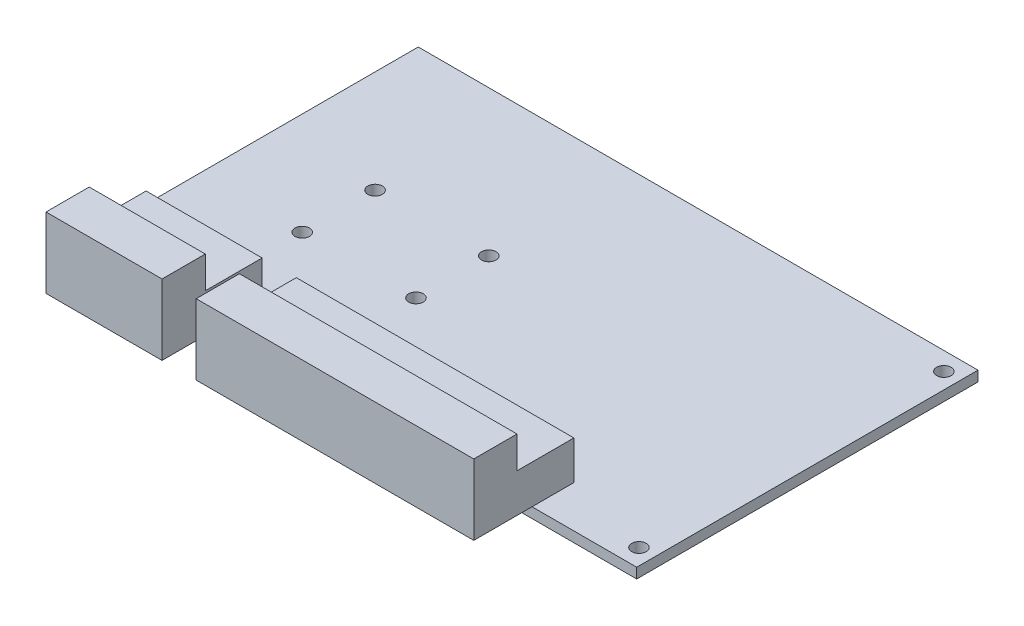
ISO-10303-21;
HEADER;
FILE_DESCRIPTION(('STEP AP214'),'2;1');
FILE_NAME('part.step','',(''),(''),'','','');
FILE_SCHEMA(('AUTOMOTIVE_DESIGN { 1 0 10303 214 1 1 1 1 }'));
ENDSEC;
DATA;
#1=APPLICATION_CONTEXT('core data for automotive mechanical design processes');
#2=APPLICATION_PROTOCOL_DEFINITION('international standard','automotive_design',2000,#1);
#3=PRODUCT_CONTEXT('',#1,'mechanical');
#4=PRODUCT('Part','Part','',(#3));
#5=PRODUCT_RELATED_PRODUCT_CATEGORY('part','',(#4));
#6=PRODUCT_DEFINITION_FORMATION('','',#4);
#7=PRODUCT_DEFINITION_CONTEXT('part definition',#1,'design');
#8=PRODUCT_DEFINITION('design','',#6,#7);
#9=PRODUCT_DEFINITION_SHAPE('','',#8);
#10=(LENGTH_UNIT() NAMED_UNIT(*) SI_UNIT(.MILLI.,.METRE.));
#11=(NAMED_UNIT(*) PLANE_ANGLE_UNIT() SI_UNIT($,.RADIAN.));
#12=(NAMED_UNIT(*) SI_UNIT($,.STERADIAN.) SOLID_ANGLE_UNIT());
#13=UNCERTAINTY_MEASURE_WITH_UNIT(LENGTH_MEASURE(1.E-05),#10,'distance_accuracy_value','');
#14=(GEOMETRIC_REPRESENTATION_CONTEXT(3) GLOBAL_UNCERTAINTY_ASSIGNED_CONTEXT((#13)) GLOBAL_UNIT_ASSIGNED_CONTEXT((#10,
#11,#12)) REPRESENTATION_CONTEXT('',''));
#15=CARTESIAN_POINT('',(0.,0.,0.));
#16=DIRECTION('',(0.,0.,1.));
#17=DIRECTION('',(1.,0.,0.));
#18=AXIS2_PLACEMENT_3D('',#15,#16,#17);
#19=CARTESIAN_POINT('',(0.,2.25,0.));
#20=DIRECTION('',(0.,-1.,0.));
#21=DIRECTION('',(0.,0.,-1.));
#22=AXIS2_PLACEMENT_3D('',#19,#20,#21);
#23=PLANE('',#22);
#24=CARTESIAN_POINT('',(119.5,2.25,-71.));
#25=DIRECTION('',(0.,1.,0.));
#26=DIRECTION('',(0.,0.,1.));
#27=AXIS2_PLACEMENT_3D('',#24,#25,#26);
#28=CIRCLE('',#27,1.60000000000001);
#29=CARTESIAN_POINT('',(119.5,2.25,-69.4));
#30=VERTEX_POINT('',#29);
#31=EDGE_CURVE('E302',#30,#30,#28,.T.);
#32=ORIENTED_EDGE('',*,*,#31,.F.);
#33=EDGE_LOOP('',(#32));
#34=FACE_BOUND('',#33,.T.);
#35=CARTESIAN_POINT('',(119.5,2.25,-4.));
#36=DIRECTION('',(0.,1.,0.));
#37=DIRECTION('',(0.,0.,1.));
#38=AXIS2_PLACEMENT_3D('',#35,#36,#37);
#39=CIRCLE('',#38,1.60000000000001);
#40=CARTESIAN_POINT('',(119.5,2.25,-2.4));
#41=VERTEX_POINT('',#40);
#42=EDGE_CURVE('E296',#41,#41,#39,.T.);
#43=ORIENTED_EDGE('',*,*,#42,.F.);
#44=EDGE_LOOP('',(#43));
#45=FACE_BOUND('',#44,.T.);
#46=CARTESIAN_POINT('',(3.5,2.25,-4.));
#47=DIRECTION('',(0.,1.,0.));
#48=DIRECTION('',(0.,0.,1.));
#49=AXIS2_PLACEMENT_3D('',#46,#47,#48);
#50=CIRCLE('',#49,1.6);
#51=CARTESIAN_POINT('',(3.5,2.25,-2.4));
#52=VERTEX_POINT('',#51);
#53=EDGE_CURVE('E290',#52,#52,#50,.T.);
#54=ORIENTED_EDGE('',*,*,#53,.F.);
#55=EDGE_LOOP('',(#54));
#56=FACE_BOUND('',#55,.T.);
#57=CARTESIAN_POINT('',(22.5,2.25,-43.));
#58=DIRECTION('',(0.,1.,0.));
#59=DIRECTION('',(0.,0.,1.));
#60=AXIS2_PLACEMENT_3D('',#57,#58,#59);
#61=CIRCLE('',#60,1.6);
#62=CARTESIAN_POINT('',(22.5,2.25,-41.4));
#63=VERTEX_POINT('',#62);
#64=EDGE_CURVE('E284',#63,#63,#61,.T.);
#65=ORIENTED_EDGE('',*,*,#64,.F.);
#66=EDGE_LOOP('',(#65));
#67=FACE_BOUND('',#66,.T.);
#68=CARTESIAN_POINT('',(47.5,2.25,-43.));
#69=DIRECTION('',(0.,1.,0.));
#70=DIRECTION('',(0.,0.,1.));
#71=AXIS2_PLACEMENT_3D('',#68,#69,#70);
#72=CIRCLE('',#71,1.6);
#73=CARTESIAN_POINT('',(47.5,2.25,-41.4));
#74=VERTEX_POINT('',#73);
#75=EDGE_CURVE('E278',#74,#74,#72,.T.);
#76=ORIENTED_EDGE('',*,*,#75,.F.);
#77=EDGE_LOOP('',(#76));
#78=FACE_BOUND('',#77,.T.);
#79=CARTESIAN_POINT('',(22.5,2.25,-27.));
#80=DIRECTION('',(0.,1.,0.));
#81=DIRECTION('',(0.,0.,1.));
#82=AXIS2_PLACEMENT_3D('',#79,#80,#81);
#83=CIRCLE('',#82,1.6);
#84=CARTESIAN_POINT('',(22.5,2.25,-25.4));
#85=VERTEX_POINT('',#84);
#86=EDGE_CURVE('E272',#85,#85,#83,.T.);
#87=ORIENTED_EDGE('',*,*,#86,.F.);
#88=EDGE_LOOP('',(#87));
#89=FACE_BOUND('',#88,.T.);
#90=CARTESIAN_POINT('',(47.5,2.25,-27.));
#91=DIRECTION('',(0.,1.,0.));
#92=DIRECTION('',(0.,0.,1.));
#93=AXIS2_PLACEMENT_3D('',#90,#91,#92);
#94=CIRCLE('',#93,1.6);
#95=CARTESIAN_POINT('',(47.5,2.25,-25.4));
#96=VERTEX_POINT('',#95);
#97=EDGE_CURVE('E266',#96,#96,#94,.T.);
#98=ORIENTED_EDGE('',*,*,#97,.F.);
#99=EDGE_LOOP('',(#98));
#100=FACE_BOUND('',#99,.T.);
#101=DIRECTION('',(0.,0.,1.));
#102=VECTOR('',#101,1.);
#103=CARTESIAN_POINT('',(39.,2.25,-9.2));
#104=LINE('',#103,#102);
#105=CARTESIAN_POINT('',(39.,2.25,-9.2));
#106=VERTEX_POINT('',#105);
#107=CARTESIAN_POINT('',(39.,2.25,0.));
#108=VERTEX_POINT('',#107);
#109=EDGE_CURVE('E222',#106,#108,#104,.T.);
#110=ORIENTED_EDGE('',*,*,#109,.F.);
#111=DIRECTION('',(-1.,0.,0.));
#112=VECTOR('',#111,1.);
#113=CARTESIAN_POINT('',(39.,2.25,-9.2));
#114=LINE('',#113,#112);
#115=CARTESIAN_POINT('',(100.,2.25,-9.2));
#116=VERTEX_POINT('',#115);
#117=EDGE_CURVE('E217',#116,#106,#114,.T.);
#118=ORIENTED_EDGE('',*,*,#117,.F.);
#119=DIRECTION('',(0.,0.,-1.));
#120=VECTOR('',#119,1.);
#121=CARTESIAN_POINT('',(100.,2.25,-9.2));
#122=LINE('',#121,#120);
#123=CARTESIAN_POINT('',(100.,2.25,0.));
#124=VERTEX_POINT('',#123);
#125=EDGE_CURVE('E226',#124,#116,#122,.T.);
#126=ORIENTED_EDGE('',*,*,#125,.F.);
#127=DIRECTION('',(1.,0.,0.));
#128=VECTOR('',#127,1.);
#129=CARTESIAN_POINT('',(0.,2.25,0.));
#130=LINE('',#129,#128);
#131=CARTESIAN_POINT('',(123.,2.25,0.));
#132=VERTEX_POINT('',#131);
#133=EDGE_CURVE('E311',#124,#132,#130,.T.);
#134=ORIENTED_EDGE('',*,*,#133,.T.);
#135=DIRECTION('',(0.,0.,-1.));
#136=VECTOR('',#135,1.);
#137=CARTESIAN_POINT('',(123.,2.25,0.));
#138=LINE('',#137,#136);
#139=CARTESIAN_POINT('',(123.,2.25,-75.));
#140=VERTEX_POINT('',#139);
#141=EDGE_CURVE('E316',#132,#140,#138,.T.);
#142=ORIENTED_EDGE('',*,*,#141,.T.);
#143=DIRECTION('',(-1.,0.,0.));
#144=VECTOR('',#143,1.);
#145=CARTESIAN_POINT('',(0.,2.25,-75.));
#146=LINE('',#145,#144);
#147=CARTESIAN_POINT('',(0.,2.25,-75.));
#148=VERTEX_POINT('',#147);
#149=EDGE_CURVE('E319',#140,#148,#146,.T.);
#150=ORIENTED_EDGE('',*,*,#149,.T.);
#151=DIRECTION('',(0.,0.,1.));
#152=VECTOR('',#151,1.);
#153=CARTESIAN_POINT('',(0.,2.25,0.));
#154=LINE('',#153,#152);
#155=CARTESIAN_POINT('',(0.,2.25,0.));
#156=VERTEX_POINT('',#155);
#157=EDGE_CURVE('E308',#148,#156,#154,.T.);
#158=ORIENTED_EDGE('',*,*,#157,.T.);
#159=CARTESIAN_POINT('',(6.,2.25,0.));
#160=VERTEX_POINT('',#159);
#161=EDGE_CURVE('E313',#156,#160,#130,.T.);
#162=ORIENTED_EDGE('',*,*,#161,.T.);
#163=DIRECTION('',(0.,0.,1.));
#164=VECTOR('',#163,1.);
#165=CARTESIAN_POINT('',(6.,2.25,-9.2));
#166=LINE('',#165,#164);
#167=CARTESIAN_POINT('',(6.,2.25,-9.2));
#168=VERTEX_POINT('',#167);
#169=EDGE_CURVE('E246',#168,#160,#166,.T.);
#170=ORIENTED_EDGE('',*,*,#169,.F.);
#171=DIRECTION('',(-1.,0.,0.));
#172=VECTOR('',#171,1.);
#173=CARTESIAN_POINT('',(6.,2.25,-9.2));
#174=LINE('',#173,#172);
#175=CARTESIAN_POINT('',(31.5,2.25,-9.2));
#176=VERTEX_POINT('',#175);
#177=EDGE_CURVE('E241',#176,#168,#174,.T.);
#178=ORIENTED_EDGE('',*,*,#177,.F.);
#179=DIRECTION('',(0.,0.,-1.));
#180=VECTOR('',#179,1.);
#181=CARTESIAN_POINT('',(31.5,2.25,-9.2));
#182=LINE('',#181,#180);
#183=CARTESIAN_POINT('',(31.5,2.25,0.));
#184=VERTEX_POINT('',#183);
#185=EDGE_CURVE('E11',#184,#176,#182,.T.);
#186=ORIENTED_EDGE('',*,*,#185,.F.);
#187=EDGE_CURVE('E361',#184,#108,#130,.T.);
#188=ORIENTED_EDGE('',*,*,#187,.T.);
#189=EDGE_LOOP('',(#110,#118,#126,#134,#142,#150,#158,#162,#170,#178,#186,#188));
#190=FACE_BOUND('',#189,.T.);
#191=ADVANCED_FACE('F34',(#34,#45,#56,#67,#78,#89,#100,#190),#23,.F.);
#192=CARTESIAN_POINT('',(0.,0.,0.));
#193=DIRECTION('',(0.,-1.,0.));
#194=DIRECTION('',(0.,0.,-1.));
#195=AXIS2_PLACEMENT_3D('',#192,#193,#194);
#196=PLANE('',#195);
#197=CARTESIAN_POINT('',(22.5,0.,-27.));
#198=DIRECTION('',(0.,1.,0.));
#199=DIRECTION('',(0.,0.,1.));
#200=AXIS2_PLACEMENT_3D('',#197,#198,#199);
#201=CIRCLE('',#200,1.6);
#202=CARTESIAN_POINT('',(22.5,0.,-25.4));
#203=VERTEX_POINT('',#202);
#204=EDGE_CURVE('E269',#203,#203,#201,.T.);
#205=ORIENTED_EDGE('',*,*,#204,.T.);
#206=EDGE_LOOP('',(#205));
#207=FACE_BOUND('',#206,.T.);
#208=CARTESIAN_POINT('',(22.5,0.,-43.));
#209=DIRECTION('',(0.,1.,0.));
#210=DIRECTION('',(0.,0.,1.));
#211=AXIS2_PLACEMENT_3D('',#208,#209,#210);
#212=CIRCLE('',#211,1.6);
#213=CARTESIAN_POINT('',(22.5,0.,-41.4));
#214=VERTEX_POINT('',#213);
#215=EDGE_CURVE('E281',#214,#214,#212,.T.);
#216=ORIENTED_EDGE('',*,*,#215,.T.);
#217=EDGE_LOOP('',(#216));
#218=FACE_BOUND('',#217,.T.);
#219=CARTESIAN_POINT('',(119.5,0.,-4.));
#220=DIRECTION('',(0.,1.,0.));
#221=DIRECTION('',(0.,0.,1.));
#222=AXIS2_PLACEMENT_3D('',#219,#220,#221);
#223=CIRCLE('',#222,1.60000000000001);
#224=CARTESIAN_POINT('',(119.5,0.,-2.4));
#225=VERTEX_POINT('',#224);
#226=EDGE_CURVE('E293',#225,#225,#223,.T.);
#227=ORIENTED_EDGE('',*,*,#226,.T.);
#228=EDGE_LOOP('',(#227));
#229=FACE_BOUND('',#228,.T.);
#230=DIRECTION('',(0.,0.,1.));
#231=VECTOR('',#230,1.);
#232=CARTESIAN_POINT('',(0.,0.,0.));
#233=LINE('',#232,#231);
#234=CARTESIAN_POINT('',(0.,0.,-75.));
#235=VERTEX_POINT('',#234);
#236=CARTESIAN_POINT('',(0.,0.,0.));
#237=VERTEX_POINT('',#236);
#238=EDGE_CURVE('E305',#235,#237,#233,.T.);
#239=ORIENTED_EDGE('',*,*,#238,.F.);
#240=DIRECTION('',(-1.,0.,0.));
#241=VECTOR('',#240,1.);
#242=CARTESIAN_POINT('',(0.,0.,-75.));
#243=LINE('',#242,#241);
#244=CARTESIAN_POINT('',(123.,0.,-75.));
#245=VERTEX_POINT('',#244);
#246=EDGE_CURVE('E312',#245,#235,#243,.T.);
#247=ORIENTED_EDGE('',*,*,#246,.F.);
#248=DIRECTION('',(0.,0.,-1.));
#249=VECTOR('',#248,1.);
#250=CARTESIAN_POINT('',(123.,0.,0.));
#251=LINE('',#250,#249);
#252=CARTESIAN_POINT('',(123.,0.,0.));
#253=VERTEX_POINT('',#252);
#254=EDGE_CURVE('E326',#253,#245,#251,.T.);
#255=ORIENTED_EDGE('',*,*,#254,.F.);
#256=DIRECTION('',(1.,0.,0.));
#257=VECTOR('',#256,1.);
#258=CARTESIAN_POINT('',(0.,0.,0.));
#259=LINE('',#258,#257);
#260=EDGE_CURVE('E324',#237,#253,#259,.T.);
#261=ORIENTED_EDGE('',*,*,#260,.F.);
#262=EDGE_LOOP('',(#239,#247,#255,#261));
#263=FACE_BOUND('',#262,.T.);
#264=CARTESIAN_POINT('',(119.5,0.,-71.));
#265=DIRECTION('',(0.,1.,0.));
#266=DIRECTION('',(0.,0.,1.));
#267=AXIS2_PLACEMENT_3D('',#264,#265,#266);
#268=CIRCLE('',#267,1.60000000000001);
#269=CARTESIAN_POINT('',(119.5,0.,-69.4));
#270=VERTEX_POINT('',#269);
#271=EDGE_CURVE('E299',#270,#270,#268,.T.);
#272=ORIENTED_EDGE('',*,*,#271,.T.);
#273=EDGE_LOOP('',(#272));
#274=FACE_BOUND('',#273,.T.);
#275=CARTESIAN_POINT('',(3.5,0.,-4.));
#276=DIRECTION('',(0.,1.,0.));
#277=DIRECTION('',(0.,0.,1.));
#278=AXIS2_PLACEMENT_3D('',#275,#276,#277);
#279=CIRCLE('',#278,1.6);
#280=CARTESIAN_POINT('',(3.5,0.,-2.4));
#281=VERTEX_POINT('',#280);
#282=EDGE_CURVE('E287',#281,#281,#279,.T.);
#283=ORIENTED_EDGE('',*,*,#282,.T.);
#284=EDGE_LOOP('',(#283));
#285=FACE_BOUND('',#284,.T.);
#286=CARTESIAN_POINT('',(47.5,0.,-43.));
#287=DIRECTION('',(0.,1.,0.));
#288=DIRECTION('',(0.,0.,1.));
#289=AXIS2_PLACEMENT_3D('',#286,#287,#288);
#290=CIRCLE('',#289,1.6);
#291=CARTESIAN_POINT('',(47.5,0.,-41.4));
#292=VERTEX_POINT('',#291);
#293=EDGE_CURVE('E275',#292,#292,#290,.T.);
#294=ORIENTED_EDGE('',*,*,#293,.T.);
#295=EDGE_LOOP('',(#294));
#296=FACE_BOUND('',#295,.T.);
#297=CARTESIAN_POINT('',(47.5,0.,-27.));
#298=DIRECTION('',(0.,1.,0.));
#299=DIRECTION('',(0.,0.,1.));
#300=AXIS2_PLACEMENT_3D('',#297,#298,#299);
#301=CIRCLE('',#300,1.6);
#302=CARTESIAN_POINT('',(47.5,0.,-25.4));
#303=VERTEX_POINT('',#302);
#304=EDGE_CURVE('E265',#303,#303,#301,.T.);
#305=ORIENTED_EDGE('',*,*,#304,.T.);
#306=EDGE_LOOP('',(#305));
#307=FACE_BOUND('',#306,.T.);
#308=ADVANCED_FACE('F349',(#207,#218,#229,#263,#274,#285,#296,#307),#196,.T.);
#309=CARTESIAN_POINT('',(0.,2.25,0.));
#310=DIRECTION('',(1.,0.,0.));
#311=DIRECTION('',(0.,0.,-1.));
#312=AXIS2_PLACEMENT_3D('',#309,#310,#311);
#313=PLANE('',#312);
#314=ORIENTED_EDGE('',*,*,#238,.T.);
#315=DIRECTION('',(0.,-1.,0.));
#316=VECTOR('',#315,1.);
#317=CARTESIAN_POINT('',(0.,2.25,0.));
#318=LINE('',#317,#316);
#319=EDGE_CURVE('E38',#156,#237,#318,.T.);
#320=ORIENTED_EDGE('',*,*,#319,.F.);
#321=ORIENTED_EDGE('',*,*,#157,.F.);
#322=DIRECTION('',(0.,-1.,0.));
#323=VECTOR('',#322,1.);
#324=CARTESIAN_POINT('',(0.,2.25,-75.));
#325=LINE('',#324,#323);
#326=EDGE_CURVE('E321',#148,#235,#325,.T.);
#327=ORIENTED_EDGE('',*,*,#326,.T.);
#328=EDGE_LOOP('',(#314,#320,#321,#327));
#329=FACE_BOUND('',#328,.T.);
#330=ADVANCED_FACE('F36',(#329),#313,.F.);
#331=CARTESIAN_POINT('',(0.,2.25,0.));
#332=DIRECTION('',(0.,0.,-1.));
#333=DIRECTION('',(-1.,0.,0.));
#334=AXIS2_PLACEMENT_3D('',#331,#332,#333);
#335=PLANE('',#334);
#336=ORIENTED_EDGE('',*,*,#260,.T.);
#337=DIRECTION('',(0.,-1.,0.));
#338=VECTOR('',#337,1.);
#339=CARTESIAN_POINT('',(123.,2.25,0.));
#340=LINE('',#339,#338);
#341=EDGE_CURVE('E333',#132,#253,#340,.T.);
#342=ORIENTED_EDGE('',*,*,#341,.F.);
#343=ORIENTED_EDGE('',*,*,#133,.F.);
#344=EDGE_CURVE('E360',#108,#124,#130,.T.);
#345=ORIENTED_EDGE('',*,*,#344,.F.);
#346=ORIENTED_EDGE('',*,*,#187,.F.);
#347=EDGE_CURVE('E317',#160,#184,#130,.T.);
#348=ORIENTED_EDGE('',*,*,#347,.F.);
#349=ORIENTED_EDGE('',*,*,#161,.F.);
#350=ORIENTED_EDGE('',*,*,#319,.T.);
#351=EDGE_LOOP('',(#336,#342,#343,#345,#346,#348,#349,#350));
#352=FACE_BOUND('',#351,.T.);
#353=ADVANCED_FACE('F342',(#352),#335,.F.);
#354=CARTESIAN_POINT('',(123.,2.25,0.));
#355=DIRECTION('',(-1.,0.,0.));
#356=DIRECTION('',(0.,0.,1.));
#357=AXIS2_PLACEMENT_3D('',#354,#355,#356);
#358=PLANE('',#357);
#359=ORIENTED_EDGE('',*,*,#254,.T.);
#360=DIRECTION('',(0.,-1.,0.));
#361=VECTOR('',#360,1.);
#362=CARTESIAN_POINT('',(123.,2.25,-75.));
#363=LINE('',#362,#361);
#364=EDGE_CURVE('E331',#140,#245,#363,.T.);
#365=ORIENTED_EDGE('',*,*,#364,.F.);
#366=ORIENTED_EDGE('',*,*,#141,.F.);
#367=ORIENTED_EDGE('',*,*,#341,.T.);
#368=EDGE_LOOP('',(#359,#365,#366,#367));
#369=FACE_BOUND('',#368,.T.);
#370=ADVANCED_FACE('F352',(#369),#358,.F.);
#371=CARTESIAN_POINT('',(0.,2.25,-75.));
#372=DIRECTION('',(0.,0.,1.));
#373=DIRECTION('',(1.,0.,0.));
#374=AXIS2_PLACEMENT_3D('',#371,#372,#373);
#375=PLANE('',#374);
#376=ORIENTED_EDGE('',*,*,#246,.T.);
#377=ORIENTED_EDGE('',*,*,#326,.F.);
#378=ORIENTED_EDGE('',*,*,#149,.F.);
#379=ORIENTED_EDGE('',*,*,#364,.T.);
#380=EDGE_LOOP('',(#376,#377,#378,#379));
#381=FACE_BOUND('',#380,.T.);
#382=ADVANCED_FACE('F355',(#381),#375,.F.);
#383=CARTESIAN_POINT('',(119.5,2.25,-71.));
#384=DIRECTION('',(0.,-1.,0.));
#385=DIRECTION('',(0.,0.,-1.));
#386=AXIS2_PLACEMENT_3D('',#383,#384,#385);
#387=CYLINDRICAL_SURFACE('',#386,1.60000000000001);
#388=ORIENTED_EDGE('',*,*,#31,.T.);
#389=EDGE_LOOP('',(#388));
#390=FACE_BOUND('',#389,.T.);
#391=ORIENTED_EDGE('',*,*,#271,.F.);
#392=EDGE_LOOP('',(#391));
#393=FACE_BOUND('',#392,.T.);
#394=ADVANCED_FACE('F416',(#390,#393),#387,.F.);
#395=CARTESIAN_POINT('',(119.5,2.25,-4.));
#396=DIRECTION('',(0.,-1.,0.));
#397=DIRECTION('',(0.,0.,-1.));
#398=AXIS2_PLACEMENT_3D('',#395,#396,#397);
#399=CYLINDRICAL_SURFACE('',#398,1.60000000000001);
#400=ORIENTED_EDGE('',*,*,#42,.T.);
#401=EDGE_LOOP('',(#400));
#402=FACE_BOUND('',#401,.T.);
#403=ORIENTED_EDGE('',*,*,#226,.F.);
#404=EDGE_LOOP('',(#403));
#405=FACE_BOUND('',#404,.T.);
#406=ADVANCED_FACE('F459',(#402,#405),#399,.F.);
#407=CARTESIAN_POINT('',(3.5,2.25,-4.));
#408=DIRECTION('',(0.,-1.,0.));
#409=DIRECTION('',(0.,0.,-1.));
#410=AXIS2_PLACEMENT_3D('',#407,#408,#409);
#411=CYLINDRICAL_SURFACE('',#410,1.6);
#412=ORIENTED_EDGE('',*,*,#53,.T.);
#413=EDGE_LOOP('',(#412));
#414=FACE_BOUND('',#413,.T.);
#415=ORIENTED_EDGE('',*,*,#282,.F.);
#416=EDGE_LOOP('',(#415));
#417=FACE_BOUND('',#416,.T.);
#418=ADVANCED_FACE('F467',(#414,#417),#411,.F.);
#419=CARTESIAN_POINT('',(22.5,2.25,-43.));
#420=DIRECTION('',(0.,-1.,0.));
#421=DIRECTION('',(0.,0.,-1.));
#422=AXIS2_PLACEMENT_3D('',#419,#420,#421);
#423=CYLINDRICAL_SURFACE('',#422,1.6);
#424=ORIENTED_EDGE('',*,*,#64,.T.);
#425=EDGE_LOOP('',(#424));
#426=FACE_BOUND('',#425,.T.);
#427=ORIENTED_EDGE('',*,*,#215,.F.);
#428=EDGE_LOOP('',(#427));
#429=FACE_BOUND('',#428,.T.);
#430=ADVANCED_FACE('F475',(#426,#429),#423,.F.);
#431=CARTESIAN_POINT('',(47.5,2.25,-43.));
#432=DIRECTION('',(0.,-1.,0.));
#433=DIRECTION('',(0.,0.,-1.));
#434=AXIS2_PLACEMENT_3D('',#431,#432,#433);
#435=CYLINDRICAL_SURFACE('',#434,1.6);
#436=ORIENTED_EDGE('',*,*,#75,.T.);
#437=EDGE_LOOP('',(#436));
#438=FACE_BOUND('',#437,.T.);
#439=ORIENTED_EDGE('',*,*,#293,.F.);
#440=EDGE_LOOP('',(#439));
#441=FACE_BOUND('',#440,.T.);
#442=ADVANCED_FACE('F484',(#438,#441),#435,.F.);
#443=CARTESIAN_POINT('',(22.5,2.25,-27.));
#444=DIRECTION('',(0.,-1.,0.));
#445=DIRECTION('',(0.,0.,-1.));
#446=AXIS2_PLACEMENT_3D('',#443,#444,#445);
#447=CYLINDRICAL_SURFACE('',#446,1.6);
#448=ORIENTED_EDGE('',*,*,#86,.T.);
#449=EDGE_LOOP('',(#448));
#450=FACE_BOUND('',#449,.T.);
#451=ORIENTED_EDGE('',*,*,#204,.F.);
#452=EDGE_LOOP('',(#451));
#453=FACE_BOUND('',#452,.T.);
#454=ADVANCED_FACE('F493',(#450,#453),#447,.F.);
#455=CARTESIAN_POINT('',(47.5,2.25,-27.));
#456=DIRECTION('',(0.,-1.,0.));
#457=DIRECTION('',(0.,0.,-1.));
#458=AXIS2_PLACEMENT_3D('',#455,#456,#457);
#459=CYLINDRICAL_SURFACE('',#458,1.6);
#460=ORIENTED_EDGE('',*,*,#97,.T.);
#461=EDGE_LOOP('',(#460));
#462=FACE_BOUND('',#461,.T.);
#463=ORIENTED_EDGE('',*,*,#304,.F.);
#464=EDGE_LOOP('',(#463));
#465=FACE_BOUND('',#464,.T.);
#466=ADVANCED_FACE('F502',(#462,#465),#459,.F.);
#467=CARTESIAN_POINT('',(0.,2.25,0.));
#468=DIRECTION('',(0.,1.,0.));
#469=DIRECTION('',(0.,0.,1.));
#470=AXIS2_PLACEMENT_3D('',#467,#468,#469);
#471=PLANE('',#470);
#472=CARTESIAN_POINT('',(6.,2.25,12.8));
#473=VERTEX_POINT('',#472);
#474=EDGE_CURVE('E172',#160,#473,#166,.T.);
#475=ORIENTED_EDGE('',*,*,#474,.F.);
#476=ORIENTED_EDGE('',*,*,#347,.T.);
#477=CARTESIAN_POINT('',(31.5,2.25,12.8));
#478=VERTEX_POINT('',#477);
#479=EDGE_CURVE('E44',#478,#184,#182,.T.);
#480=ORIENTED_EDGE('',*,*,#479,.F.);
#481=DIRECTION('',(1.,0.,0.));
#482=VECTOR('',#481,1.);
#483=CARTESIAN_POINT('',(6.,2.25,12.8));
#484=LINE('',#483,#482);
#485=EDGE_CURVE('E249',#473,#478,#484,.T.);
#486=ORIENTED_EDGE('',*,*,#485,.F.);
#487=EDGE_LOOP('',(#475,#476,#480,#486));
#488=FACE_BOUND('',#487,.T.);
#489=ADVANCED_FACE('F370',(#488),#471,.F.);
#490=CARTESIAN_POINT('',(6.,10.75,-9.2));
#491=DIRECTION('',(1.,0.,0.));
#492=DIRECTION('',(0.,0.,-1.));
#493=AXIS2_PLACEMENT_3D('',#490,#491,#492);
#494=PLANE('',#493);
#495=ORIENTED_EDGE('',*,*,#169,.T.);
#496=ORIENTED_EDGE('',*,*,#474,.T.);
#497=DIRECTION('',(0.,-1.,0.));
#498=VECTOR('',#497,1.);
#499=CARTESIAN_POINT('',(6.,10.75,12.8));
#500=LINE('',#499,#498);
#501=CARTESIAN_POINT('',(6.,17.75,12.8));
#502=VERTEX_POINT('',#501);
#503=EDGE_CURVE('E262',#502,#473,#500,.T.);
#504=ORIENTED_EDGE('',*,*,#503,.F.);
#505=DIRECTION('',(0.,0.,1.));
#506=VECTOR('',#505,1.);
#507=CARTESIAN_POINT('',(6.,17.75,12.8));
#508=LINE('',#507,#506);
#509=CARTESIAN_POINT('',(6.,17.75,3.3));
#510=VERTEX_POINT('',#509);
#511=EDGE_CURVE('E197',#510,#502,#508,.T.);
#512=ORIENTED_EDGE('',*,*,#511,.F.);
#513=DIRECTION('',(0.,-1.,0.));
#514=VECTOR('',#513,1.);
#515=CARTESIAN_POINT('',(6.,17.75,3.3));
#516=LINE('',#515,#514);
#517=CARTESIAN_POINT('',(6.,10.75,3.3));
#518=VERTEX_POINT('',#517);
#519=EDGE_CURVE('E207',#510,#518,#516,.T.);
#520=ORIENTED_EDGE('',*,*,#519,.T.);
#521=DIRECTION('',(0.,0.,1.));
#522=VECTOR('',#521,1.);
#523=CARTESIAN_POINT('',(6.,10.75,-9.2));
#524=LINE('',#523,#522);
#525=CARTESIAN_POINT('',(6.,10.75,-9.2));
#526=VERTEX_POINT('',#525);
#527=EDGE_CURVE('E238',#526,#518,#524,.T.);
#528=ORIENTED_EDGE('',*,*,#527,.F.);
#529=DIRECTION('',(0.,-1.,0.));
#530=VECTOR('',#529,1.);
#531=CARTESIAN_POINT('',(6.,10.75,-9.2));
#532=LINE('',#531,#530);
#533=EDGE_CURVE('E245',#526,#168,#532,.T.);
#534=ORIENTED_EDGE('',*,*,#533,.T.);
#535=EDGE_LOOP('',(#495,#496,#504,#512,#520,#528,#534));
#536=FACE_BOUND('',#535,.T.);
#537=ADVANCED_FACE('F386',(#536),#494,.F.);
#538=CARTESIAN_POINT('',(6.,10.75,12.8));
#539=DIRECTION('',(0.,0.,-1.));
#540=DIRECTION('',(-1.,0.,0.));
#541=AXIS2_PLACEMENT_3D('',#538,#539,#540);
#542=PLANE('',#541);
#543=ORIENTED_EDGE('',*,*,#485,.T.);
#544=DIRECTION('',(0.,-1.,0.));
#545=VECTOR('',#544,1.);
#546=CARTESIAN_POINT('',(31.5,10.75,12.8));
#547=LINE('',#546,#545);
#548=CARTESIAN_POINT('',(31.5,17.75,12.8));
#549=VERTEX_POINT('',#548);
#550=EDGE_CURVE('E259',#549,#478,#547,.T.);
#551=ORIENTED_EDGE('',*,*,#550,.F.);
#552=DIRECTION('',(1.,0.,0.));
#553=VECTOR('',#552,1.);
#554=CARTESIAN_POINT('',(6.,17.75,12.8));
#555=LINE('',#554,#553);
#556=EDGE_CURVE('E200',#502,#549,#555,.T.);
#557=ORIENTED_EDGE('',*,*,#556,.F.);
#558=ORIENTED_EDGE('',*,*,#503,.T.);
#559=EDGE_LOOP('',(#543,#551,#557,#558));
#560=FACE_BOUND('',#559,.T.);
#561=ADVANCED_FACE('F379',(#560),#542,.F.);
#562=CARTESIAN_POINT('',(31.5,10.75,-9.2));
#563=DIRECTION('',(-1.,0.,0.));
#564=DIRECTION('',(0.,0.,1.));
#565=AXIS2_PLACEMENT_3D('',#562,#563,#564);
#566=PLANE('',#565);
#567=ORIENTED_EDGE('',*,*,#479,.T.);
#568=ORIENTED_EDGE('',*,*,#185,.T.);
#569=DIRECTION('',(0.,-1.,0.));
#570=VECTOR('',#569,1.);
#571=CARTESIAN_POINT('',(31.5,10.75,-9.2));
#572=LINE('',#571,#570);
#573=CARTESIAN_POINT('',(31.5,10.75,-9.2));
#574=VERTEX_POINT('',#573);
#575=EDGE_CURVE('E256',#574,#176,#572,.T.);
#576=ORIENTED_EDGE('',*,*,#575,.F.);
#577=DIRECTION('',(0.,0.,-1.));
#578=VECTOR('',#577,1.);
#579=CARTESIAN_POINT('',(31.5,10.75,-9.2));
#580=LINE('',#579,#578);
#581=CARTESIAN_POINT('',(31.5,10.75,3.3));
#582=VERTEX_POINT('',#581);
#583=EDGE_CURVE('E240',#582,#574,#580,.T.);
#584=ORIENTED_EDGE('',*,*,#583,.F.);
#585=DIRECTION('',(0.,-1.,0.));
#586=VECTOR('',#585,1.);
#587=CARTESIAN_POINT('',(31.5,17.75,3.3));
#588=LINE('',#587,#586);
#589=CARTESIAN_POINT('',(31.5,17.75,3.3));
#590=VERTEX_POINT('',#589);
#591=EDGE_CURVE('E211',#590,#582,#588,.T.);
#592=ORIENTED_EDGE('',*,*,#591,.F.);
#593=DIRECTION('',(0.,0.,-1.));
#594=VECTOR('',#593,1.);
#595=CARTESIAN_POINT('',(31.5,17.75,12.8));
#596=LINE('',#595,#594);
#597=EDGE_CURVE('E203',#549,#590,#596,.T.);
#598=ORIENTED_EDGE('',*,*,#597,.F.);
#599=ORIENTED_EDGE('',*,*,#550,.T.);
#600=EDGE_LOOP('',(#567,#568,#576,#584,#592,#598,#599));
#601=FACE_BOUND('',#600,.T.);
#602=ADVANCED_FACE('F373',(#601),#566,.F.);
#603=CARTESIAN_POINT('',(6.,10.75,-9.2));
#604=DIRECTION('',(0.,0.,1.));
#605=DIRECTION('',(1.,0.,0.));
#606=AXIS2_PLACEMENT_3D('',#603,#604,#605);
#607=PLANE('',#606);
#608=ORIENTED_EDGE('',*,*,#177,.T.);
#609=ORIENTED_EDGE('',*,*,#533,.F.);
#610=DIRECTION('',(-1.,0.,0.));
#611=VECTOR('',#610,1.);
#612=CARTESIAN_POINT('',(6.,10.75,-9.2));
#613=LINE('',#612,#611);
#614=EDGE_CURVE('E243',#574,#526,#613,.T.);
#615=ORIENTED_EDGE('',*,*,#614,.F.);
#616=ORIENTED_EDGE('',*,*,#575,.T.);
#617=EDGE_LOOP('',(#608,#609,#615,#616));
#618=FACE_BOUND('',#617,.T.);
#619=ADVANCED_FACE('F390',(#618),#607,.F.);
#620=CARTESIAN_POINT('',(0.,10.75,0.));
#621=DIRECTION('',(0.,1.,0.));
#622=DIRECTION('',(0.,0.,1.));
#623=AXIS2_PLACEMENT_3D('',#620,#621,#622);
#624=PLANE('',#623);
#625=DIRECTION('',(-1.,0.,0.));
#626=VECTOR('',#625,1.);
#627=CARTESIAN_POINT('',(6.,10.75,3.3));
#628=LINE('',#627,#626);
#629=EDGE_CURVE('E59',#582,#518,#628,.T.);
#630=ORIENTED_EDGE('',*,*,#629,.F.);
#631=ORIENTED_EDGE('',*,*,#583,.T.);
#632=ORIENTED_EDGE('',*,*,#614,.T.);
#633=ORIENTED_EDGE('',*,*,#527,.T.);
#634=EDGE_LOOP('',(#630,#631,#632,#633));
#635=FACE_BOUND('',#634,.T.);
#636=ADVANCED_FACE('F558',(#635),#624,.T.);
#637=CARTESIAN_POINT('',(0.,2.25,0.));
#638=DIRECTION('',(0.,1.,0.));
#639=DIRECTION('',(0.,0.,1.));
#640=AXIS2_PLACEMENT_3D('',#637,#638,#639);
#641=PLANE('',#640);
#642=CARTESIAN_POINT('',(39.,2.25,12.8));
#643=VERTEX_POINT('',#642);
#644=EDGE_CURVE('E169',#108,#643,#104,.T.);
#645=ORIENTED_EDGE('',*,*,#644,.F.);
#646=ORIENTED_EDGE('',*,*,#344,.T.);
#647=CARTESIAN_POINT('',(100.,2.25,12.8));
#648=VERTEX_POINT('',#647);
#649=EDGE_CURVE('E227',#648,#124,#122,.T.);
#650=ORIENTED_EDGE('',*,*,#649,.F.);
#651=DIRECTION('',(1.,0.,0.));
#652=VECTOR('',#651,1.);
#653=CARTESIAN_POINT('',(39.,2.25,12.8));
#654=LINE('',#653,#652);
#655=EDGE_CURVE('E224',#643,#648,#654,.T.);
#656=ORIENTED_EDGE('',*,*,#655,.F.);
#657=EDGE_LOOP('',(#645,#646,#650,#656));
#658=FACE_BOUND('',#657,.T.);
#659=ADVANCED_FACE('F567',(#658),#641,.F.);
#660=CARTESIAN_POINT('',(39.,10.75,-9.2));
#661=DIRECTION('',(1.,0.,0.));
#662=DIRECTION('',(0.,0.,-1.));
#663=AXIS2_PLACEMENT_3D('',#660,#661,#662);
#664=PLANE('',#663);
#665=ORIENTED_EDGE('',*,*,#109,.T.);
#666=ORIENTED_EDGE('',*,*,#644,.T.);
#667=DIRECTION('',(0.,-1.,0.));
#668=VECTOR('',#667,1.);
#669=CARTESIAN_POINT('',(39.,10.75,12.8));
#670=LINE('',#669,#668);
#671=CARTESIAN_POINT('',(39.,17.75,12.8));
#672=VERTEX_POINT('',#671);
#673=EDGE_CURVE('E161',#672,#643,#670,.T.);
#674=ORIENTED_EDGE('',*,*,#673,.F.);
#675=DIRECTION('',(0.,0.,1.));
#676=VECTOR('',#675,1.);
#677=CARTESIAN_POINT('',(39.,17.75,12.8));
#678=LINE('',#677,#676);
#679=CARTESIAN_POINT('',(39.,17.75,3.3));
#680=VERTEX_POINT('',#679);
#681=EDGE_CURVE('E167',#680,#672,#678,.T.);
#682=ORIENTED_EDGE('',*,*,#681,.F.);
#683=DIRECTION('',(0.,-1.,0.));
#684=VECTOR('',#683,1.);
#685=CARTESIAN_POINT('',(39.,17.75,3.3));
#686=LINE('',#685,#684);
#687=CARTESIAN_POINT('',(39.,10.75,3.3));
#688=VERTEX_POINT('',#687);
#689=EDGE_CURVE('E191',#680,#688,#686,.T.);
#690=ORIENTED_EDGE('',*,*,#689,.T.);
#691=DIRECTION('',(0.,0.,1.));
#692=VECTOR('',#691,1.);
#693=CARTESIAN_POINT('',(39.,10.75,-9.2));
#694=LINE('',#693,#692);
#695=CARTESIAN_POINT('',(39.,10.75,-9.2));
#696=VERTEX_POINT('',#695);
#697=EDGE_CURVE('E214',#696,#688,#694,.T.);
#698=ORIENTED_EDGE('',*,*,#697,.F.);
#699=DIRECTION('',(0.,-1.,0.));
#700=VECTOR('',#699,1.);
#701=CARTESIAN_POINT('',(39.,10.75,-9.2));
#702=LINE('',#701,#700);
#703=EDGE_CURVE('E221',#696,#106,#702,.T.);
#704=ORIENTED_EDGE('',*,*,#703,.T.);
#705=EDGE_LOOP('',(#665,#666,#674,#682,#690,#698,#704));
#706=FACE_BOUND('',#705,.T.);
#707=ADVANCED_FACE('F164',(#706),#664,.F.);
#708=CARTESIAN_POINT('',(39.,10.75,12.8));
#709=DIRECTION('',(0.,0.,-1.));
#710=DIRECTION('',(-1.,0.,0.));
#711=AXIS2_PLACEMENT_3D('',#708,#709,#710);
#712=PLANE('',#711);
#713=ORIENTED_EDGE('',*,*,#655,.T.);
#714=DIRECTION('',(0.,-1.,0.));
#715=VECTOR('',#714,1.);
#716=CARTESIAN_POINT('',(100.,10.75,12.8));
#717=LINE('',#716,#715);
#718=CARTESIAN_POINT('',(100.,17.75,12.8));
#719=VERTEX_POINT('',#718);
#720=EDGE_CURVE('E173',#719,#648,#717,.T.);
#721=ORIENTED_EDGE('',*,*,#720,.F.);
#722=DIRECTION('',(1.,0.,0.));
#723=VECTOR('',#722,1.);
#724=CARTESIAN_POINT('',(39.,17.75,12.8));
#725=LINE('',#724,#723);
#726=EDGE_CURVE('E176',#672,#719,#725,.T.);
#727=ORIENTED_EDGE('',*,*,#726,.F.);
#728=ORIENTED_EDGE('',*,*,#673,.T.);
#729=EDGE_LOOP('',(#713,#721,#727,#728));
#730=FACE_BOUND('',#729,.T.);
#731=ADVANCED_FACE('F177',(#730),#712,.F.);
#732=CARTESIAN_POINT('',(100.,10.75,-9.2));
#733=DIRECTION('',(-1.,0.,0.));
#734=DIRECTION('',(0.,0.,1.));
#735=AXIS2_PLACEMENT_3D('',#732,#733,#734);
#736=PLANE('',#735);
#737=ORIENTED_EDGE('',*,*,#649,.T.);
#738=ORIENTED_EDGE('',*,*,#125,.T.);
#739=DIRECTION('',(0.,-1.,0.));
#740=VECTOR('',#739,1.);
#741=CARTESIAN_POINT('',(100.,10.75,-9.2));
#742=LINE('',#741,#740);
#743=CARTESIAN_POINT('',(100.,10.75,-9.2));
#744=VERTEX_POINT('',#743);
#745=EDGE_CURVE('E234',#744,#116,#742,.T.);
#746=ORIENTED_EDGE('',*,*,#745,.F.);
#747=DIRECTION('',(0.,0.,-1.));
#748=VECTOR('',#747,1.);
#749=CARTESIAN_POINT('',(100.,10.75,-9.2));
#750=LINE('',#749,#748);
#751=CARTESIAN_POINT('',(100.,10.75,3.3));
#752=VERTEX_POINT('',#751);
#753=EDGE_CURVE('E216',#752,#744,#750,.T.);
#754=ORIENTED_EDGE('',*,*,#753,.F.);
#755=DIRECTION('',(0.,-1.,0.));
#756=VECTOR('',#755,1.);
#757=CARTESIAN_POINT('',(100.,17.75,3.3));
#758=LINE('',#757,#756);
#759=CARTESIAN_POINT('',(100.,17.75,3.3));
#760=VERTEX_POINT('',#759);
#761=EDGE_CURVE('E194',#760,#752,#758,.T.);
#762=ORIENTED_EDGE('',*,*,#761,.F.);
#763=DIRECTION('',(0.,0.,-1.));
#764=VECTOR('',#763,1.);
#765=CARTESIAN_POINT('',(100.,17.75,12.8));
#766=LINE('',#765,#764);
#767=EDGE_CURVE('E181',#719,#760,#766,.T.);
#768=ORIENTED_EDGE('',*,*,#767,.F.);
#769=ORIENTED_EDGE('',*,*,#720,.T.);
#770=EDGE_LOOP('',(#737,#738,#746,#754,#762,#768,#769));
#771=FACE_BOUND('',#770,.T.);
#772=ADVANCED_FACE('F590',(#771),#736,.F.);
#773=CARTESIAN_POINT('',(39.,10.75,-9.2));
#774=DIRECTION('',(0.,0.,1.));
#775=DIRECTION('',(1.,0.,0.));
#776=AXIS2_PLACEMENT_3D('',#773,#774,#775);
#777=PLANE('',#776);
#778=ORIENTED_EDGE('',*,*,#117,.T.);
#779=ORIENTED_EDGE('',*,*,#703,.F.);
#780=DIRECTION('',(-1.,0.,0.));
#781=VECTOR('',#780,1.);
#782=CARTESIAN_POINT('',(39.,10.75,-9.2));
#783=LINE('',#782,#781);
#784=EDGE_CURVE('E219',#744,#696,#783,.T.);
#785=ORIENTED_EDGE('',*,*,#784,.F.);
#786=ORIENTED_EDGE('',*,*,#745,.T.);
#787=EDGE_LOOP('',(#778,#779,#785,#786));
#788=FACE_BOUND('',#787,.T.);
#789=ADVANCED_FACE('F403',(#788),#777,.F.);
#790=CARTESIAN_POINT('',(0.,10.75,0.));
#791=DIRECTION('',(0.,1.,0.));
#792=DIRECTION('',(0.,0.,1.));
#793=AXIS2_PLACEMENT_3D('',#790,#791,#792);
#794=PLANE('',#793);
#795=DIRECTION('',(-1.,0.,0.));
#796=VECTOR('',#795,1.);
#797=CARTESIAN_POINT('',(39.,10.75,3.3));
#798=LINE('',#797,#796);
#799=EDGE_CURVE('E51',#752,#688,#798,.T.);
#800=ORIENTED_EDGE('',*,*,#799,.F.);
#801=ORIENTED_EDGE('',*,*,#753,.T.);
#802=ORIENTED_EDGE('',*,*,#784,.T.);
#803=ORIENTED_EDGE('',*,*,#697,.T.);
#804=EDGE_LOOP('',(#800,#801,#802,#803));
#805=FACE_BOUND('',#804,.T.);
#806=ADVANCED_FACE('F395',(#805),#794,.T.);
#807=CARTESIAN_POINT('',(6.,17.75,3.3));
#808=DIRECTION('',(0.,0.,1.));
#809=DIRECTION('',(1.,0.,0.));
#810=AXIS2_PLACEMENT_3D('',#807,#808,#809);
#811=PLANE('',#810);
#812=ORIENTED_EDGE('',*,*,#629,.T.);
#813=ORIENTED_EDGE('',*,*,#519,.F.);
#814=DIRECTION('',(-1.,0.,0.));
#815=VECTOR('',#814,1.);
#816=CARTESIAN_POINT('',(6.,17.75,3.3));
#817=LINE('',#816,#815);
#818=EDGE_CURVE('E205',#590,#510,#817,.T.);
#819=ORIENTED_EDGE('',*,*,#818,.F.);
#820=ORIENTED_EDGE('',*,*,#591,.T.);
#821=EDGE_LOOP('',(#812,#813,#819,#820));
#822=FACE_BOUND('',#821,.T.);
#823=ADVANCED_FACE('F393',(#822),#811,.F.);
#824=CARTESIAN_POINT('',(0.,17.75,0.));
#825=DIRECTION('',(0.,-1.,0.));
#826=DIRECTION('',(0.,0.,-1.));
#827=AXIS2_PLACEMENT_3D('',#824,#825,#826);
#828=PLANE('',#827);
#829=ORIENTED_EDGE('',*,*,#511,.T.);
#830=ORIENTED_EDGE('',*,*,#556,.T.);
#831=ORIENTED_EDGE('',*,*,#597,.T.);
#832=ORIENTED_EDGE('',*,*,#818,.T.);
#833=EDGE_LOOP('',(#829,#830,#831,#832));
#834=FACE_BOUND('',#833,.T.);
#835=ADVANCED_FACE('F381',(#834),#828,.F.);
#836=CARTESIAN_POINT('',(39.,17.75,3.3));
#837=DIRECTION('',(0.,0.,1.));
#838=DIRECTION('',(1.,0.,0.));
#839=AXIS2_PLACEMENT_3D('',#836,#837,#838);
#840=PLANE('',#839);
#841=ORIENTED_EDGE('',*,*,#799,.T.);
#842=ORIENTED_EDGE('',*,*,#689,.F.);
#843=DIRECTION('',(-1.,0.,0.));
#844=VECTOR('',#843,1.);
#845=CARTESIAN_POINT('',(39.,17.75,3.3));
#846=LINE('',#845,#844);
#847=EDGE_CURVE('E185',#760,#680,#846,.T.);
#848=ORIENTED_EDGE('',*,*,#847,.F.);
#849=ORIENTED_EDGE('',*,*,#761,.T.);
#850=EDGE_LOOP('',(#841,#842,#848,#849));
#851=FACE_BOUND('',#850,.T.);
#852=ADVANCED_FACE('F401',(#851),#840,.F.);
#853=CARTESIAN_POINT('',(0.,17.75,0.));
#854=DIRECTION('',(0.,-1.,0.));
#855=DIRECTION('',(0.,0.,-1.));
#856=AXIS2_PLACEMENT_3D('',#853,#854,#855);
#857=PLANE('',#856);
#858=ORIENTED_EDGE('',*,*,#681,.T.);
#859=ORIENTED_EDGE('',*,*,#726,.T.);
#860=ORIENTED_EDGE('',*,*,#767,.T.);
#861=ORIENTED_EDGE('',*,*,#847,.T.);
#862=EDGE_LOOP('',(#858,#859,#860,#861));
#863=FACE_BOUND('',#862,.T.);
#864=ADVANCED_FACE('F183',(#863),#857,.F.);
#865=CLOSED_SHELL('',(#191,#308,#330,#353,#370,#382,#394,#406,#418,#430,#442,#454,#466,#489,
#537,#561,#602,#619,#636,#659,#707,#731,#772,#789,#806,#823,#835,#852,#864));
#866=MANIFOLD_SOLID_BREP('B2',#865);
#867=ADVANCED_BREP_SHAPE_REPRESENTATION('',(#18,#866),#14);
#868=SHAPE_DEFINITION_REPRESENTATION(#9,#867);
ENDSEC;
END-ISO-10303-21;
